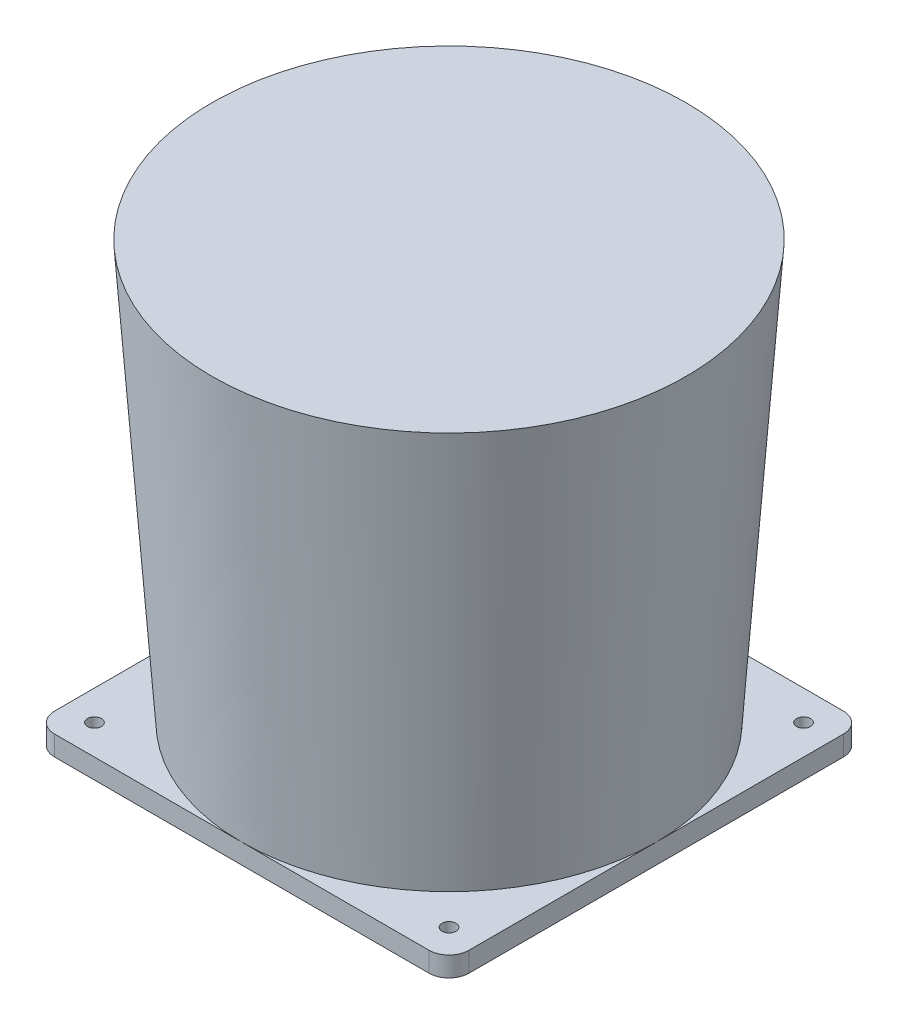
ISO-10303-21;
HEADER;
FILE_DESCRIPTION(('STEP AP214'),'2;1');
FILE_NAME('part.step','',(''),(''),'','','');
FILE_SCHEMA(('AUTOMOTIVE_DESIGN { 1 0 10303 214 1 1 1 1 }'));
ENDSEC;
DATA;
#1=APPLICATION_CONTEXT('core data for automotive mechanical design processes');
#2=APPLICATION_PROTOCOL_DEFINITION('international standard','automotive_design',2000,#1);
#3=PRODUCT_CONTEXT('',#1,'mechanical');
#4=PRODUCT('Part','Part','',(#3));
#5=PRODUCT_RELATED_PRODUCT_CATEGORY('part','',(#4));
#6=PRODUCT_DEFINITION_FORMATION('','',#4);
#7=PRODUCT_DEFINITION_CONTEXT('part definition',#1,'design');
#8=PRODUCT_DEFINITION('design','',#6,#7);
#9=PRODUCT_DEFINITION_SHAPE('','',#8);
#10=(LENGTH_UNIT() NAMED_UNIT(*) SI_UNIT(.MILLI.,.METRE.));
#11=(NAMED_UNIT(*) PLANE_ANGLE_UNIT() SI_UNIT($,.RADIAN.));
#12=(NAMED_UNIT(*) SI_UNIT($,.STERADIAN.) SOLID_ANGLE_UNIT());
#13=UNCERTAINTY_MEASURE_WITH_UNIT(LENGTH_MEASURE(1.E-05),#10,'distance_accuracy_value','');
#14=(GEOMETRIC_REPRESENTATION_CONTEXT(3) GLOBAL_UNCERTAINTY_ASSIGNED_CONTEXT((#13)) GLOBAL_UNIT_ASSIGNED_CONTEXT((#10,
#11,#12)) REPRESENTATION_CONTEXT('',''));
#15=CARTESIAN_POINT('',(0.,0.,0.));
#16=DIRECTION('',(0.,0.,1.));
#17=DIRECTION('',(1.,0.,0.));
#18=AXIS2_PLACEMENT_3D('',#15,#16,#17);
#19=CARTESIAN_POINT('',(94.,10.,-94.));
#20=DIRECTION('',(0.,-1.,0.));
#21=DIRECTION('',(0.,0.,-1.));
#22=AXIS2_PLACEMENT_3D('',#19,#20,#21);
#23=PLANE('',#22);
#24=CARTESIAN_POINT('',(-89.,10.,89.));
#25=DIRECTION('',(0.,1.,0.));
#26=DIRECTION('',(0.,0.,1.));
#27=AXIS2_PLACEMENT_3D('',#24,#25,#26);
#28=CIRCLE('',#27,3.50000000000175);
#29=CARTESIAN_POINT('',(-89.,10.,92.5000000000017));
#30=VERTEX_POINT('',#29);
#31=EDGE_CURVE('E233',#30,#30,#28,.T.);
#32=ORIENTED_EDGE('',*,*,#31,.F.);
#33=EDGE_LOOP('',(#32));
#34=FACE_BOUND('',#33,.T.);
#35=DIRECTION('',(1.,0.,0.));
#36=VECTOR('',#35,1.);
#37=CARTESIAN_POINT('',(-93.9999999999999,10.,104.));
#38=LINE('',#37,#36);
#39=CARTESIAN_POINT('',(-93.9999999999999,10.,104.));
#40=VERTEX_POINT('',#39);
#41=CARTESIAN_POINT('',(0.,10.,104.));
#42=VERTEX_POINT('',#41);
#43=EDGE_CURVE('E139',#40,#42,#38,.T.);
#44=ORIENTED_EDGE('',*,*,#43,.T.);
#45=CARTESIAN_POINT('',(0.,10.,0.));
#46=DIRECTION('',(0.,1.,0.));
#47=DIRECTION('',(0.,0.,1.));
#48=AXIS2_PLACEMENT_3D('',#45,#46,#47);
#49=CIRCLE('',#48,104.);
#50=CARTESIAN_POINT('',(-103.999999999015,10.,-0.000804642853845765));
#51=VERTEX_POINT('',#50);
#52=EDGE_CURVE('E12',#42,#51,#49,.F.);
#53=ORIENTED_EDGE('',*,*,#52,.T.);
#54=DIRECTION('',(0.,0.,1.));
#55=VECTOR('',#54,1.);
#56=CARTESIAN_POINT('',(-104.,10.,-93.9999999999999));
#57=LINE('',#56,#55);
#58=CARTESIAN_POINT('',(-104.,10.,93.9999999999999));
#59=VERTEX_POINT('',#58);
#60=EDGE_CURVE('E291',#51,#59,#57,.T.);
#61=ORIENTED_EDGE('',*,*,#60,.T.);
#62=CARTESIAN_POINT('',(-94.,10.,94.));
#63=DIRECTION('',(0.,1.,0.));
#64=DIRECTION('',(0.,0.,-1.));
#65=AXIS2_PLACEMENT_3D('',#62,#63,#64);
#66=CIRCLE('',#65,9.99999999999999);
#67=EDGE_CURVE('E140',#59,#40,#66,.T.);
#68=ORIENTED_EDGE('',*,*,#67,.T.);
#69=EDGE_LOOP('',(#44,#53,#61,#68));
#70=FACE_BOUND('',#69,.T.);
#71=ADVANCED_FACE('F41',(#34,#70),#23,.F.);
#72=CARTESIAN_POINT('',(-89.,10.,-89.));
#73=DIRECTION('',(0.,1.,0.));
#74=DIRECTION('',(0.,0.,1.));
#75=AXIS2_PLACEMENT_3D('',#72,#73,#74);
#76=CIRCLE('',#75,3.50000000000001);
#77=CARTESIAN_POINT('',(-89.,10.,-85.5));
#78=VERTEX_POINT('',#77);
#79=EDGE_CURVE('E315',#78,#78,#76,.T.);
#80=ORIENTED_EDGE('',*,*,#79,.F.);
#81=EDGE_LOOP('',(#80));
#82=FACE_BOUND('',#81,.T.);
#83=CARTESIAN_POINT('',(-104.,10.,-93.9999999999999));
#84=VERTEX_POINT('',#83);
#85=EDGE_CURVE('E295',#84,#51,#57,.T.);
#86=ORIENTED_EDGE('',*,*,#85,.T.);
#87=CARTESIAN_POINT('',(-104.000000005345,10.,-0.00105930757948736));
#88=CARTESIAN_POINT('',(-104.000090948069,10.,-1.51565821132949));
#89=CARTESIAN_POINT('',(-103.967224943124,10.,-3.03028113036444));
#90=CARTESIAN_POINT('',(-103.835542894028,10.,-6.05310630372781));
#91=CARTESIAN_POINT('',(-103.736881233049,10.,-7.56131529014842));
#92=CARTESIAN_POINT('',(-103.473630479143,10.,-10.5713033642664));
#93=CARTESIAN_POINT('',(-103.309069903499,10.,-12.073084949627));
#94=CARTESIAN_POINT('',(-102.91416092981,10.,-15.070284790968));
#95=CARTESIAN_POINT('',(-102.683715380538,10.,-16.5656903155941));
#96=CARTESIAN_POINT('',(-102.289257574568,10.,-18.8014926673374));
#97=CARTESIAN_POINT('',(-102.149484797689,10.,-19.5462429453046));
#98=CARTESIAN_POINT('',(-101.853743818732,10.,-21.0330955937771));
#99=CARTESIAN_POINT('',(-101.697763673546,10.,-21.775195588785));
#100=CARTESIAN_POINT('',(-101.206492888748,10.,-23.9921354203146));
#101=CARTESIAN_POINT('',(-100.847147605813,10.,-25.4617224986629));
#102=CARTESIAN_POINT('',(-100.065015205125,10.,-28.3816803686328));
#103=CARTESIAN_POINT('',(-99.6423168158635,10.,-29.8320749962868));
#104=CARTESIAN_POINT('',(-98.7335883078366,10.,-32.7137382665067));
#105=CARTESIAN_POINT('',(-98.247525039415,10.,-34.1449964625821));
#106=CARTESIAN_POINT('',(-97.2123192263897,10.,-36.9880772090676));
#107=CARTESIAN_POINT('',(-96.6630399574596,10.,-38.3998499460064));
#108=CARTESIAN_POINT('',(-95.5037294098261,10.,-41.1987226060328));
#109=CARTESIAN_POINT('',(-94.8936800045291,10.,-42.5858150211537));
#110=CARTESIAN_POINT('',(-93.61514007437,10.,-45.3284781834845));
#111=CARTESIAN_POINT('',(-92.9468036444064,10.,-46.684120729026));
#112=CARTESIAN_POINT('',(-91.5517058994502,10.,-49.3642420897551));
#113=CARTESIAN_POINT('',(-90.8249699653429,10.,-50.6887341231206));
#114=CARTESIAN_POINT('',(-89.3131467979113,10.,-53.3066616782509));
#115=CARTESIAN_POINT('',(-88.5279746714181,10.,-54.6000482573516));
#116=CARTESIAN_POINT('',(-87.3079361414785,10.,-56.5147113661087));
#117=CARTESIAN_POINT('',(-86.8937971972617,10.,-57.149285744373));
#118=CARTESIAN_POINT('',(-86.0515734707941,10.,-58.4097847203422));
#119=CARTESIAN_POINT('',(-85.6234786846684,10.,-59.035702633872));
#120=CARTESIAN_POINT('',(-84.3212180203946,10.,-60.8958866041932));
#121=CARTESIAN_POINT('',(-83.426838688626,10.,-62.1160944176063));
#122=CARTESIAN_POINT('',(-81.5868219835373,10.,-64.5144769246347));
#123=CARTESIAN_POINT('',(-80.641257521089,10.,-65.6927076393856));
#124=CARTESIAN_POINT('',(-78.6989378208423,10.,-68.0072615757161));
#125=CARTESIAN_POINT('',(-77.7021560100378,10.,-69.1435625068051));
#126=CARTESIAN_POINT('',(-75.6577503067496,10.,-71.3740703014073));
#127=CARTESIAN_POINT('',(-74.6100190765356,10.,-72.4681787443568));
#128=CARTESIAN_POINT('',(-72.4678708336528,10.,-74.6103523228499));
#129=CARTESIAN_POINT('',(-71.3734399395446,10.,-75.6584035773488));
#130=CARTESIAN_POINT('',(-69.1426481751464,10.,-77.7030204834573));
#131=CARTESIAN_POINT('',(-68.0064021661485,10.,-78.6997114073254));
#132=CARTESIAN_POINT('',(-65.6918608487904,10.,-80.6419412321208));
#133=CARTESIAN_POINT('',(-64.5135840242304,10.,-81.5875021691134));
#134=CARTESIAN_POINT('',(-62.1150081109515,10.,-83.4275993266169));
#135=CARTESIAN_POINT('',(-60.8946494087953,10.,-84.3220579574577));
#136=CARTESIAN_POINT('',(-59.0347733235027,10.,-85.6240852583414));
#137=CARTESIAN_POINT('',(-58.4093168266245,10.,-86.0518717102847));
#138=CARTESIAN_POINT('',(-57.1488325311045,10.,-86.8941144214826));
#139=CARTESIAN_POINT('',(-56.5137980896977,10.,-87.3085607394228));
#140=CARTESIAN_POINT('',(-54.5988046585761,10.,-88.5287923257081));
#141=CARTESIAN_POINT('',(-53.3055507936302,10.,-89.313854207235));
#142=CARTESIAN_POINT('',(-50.6877736601868,10.,-90.825528097638));
#143=CARTESIAN_POINT('',(-49.3632963500548,10.,-91.5522198272704));
#144=CARTESIAN_POINT('',(-46.6830864326956,10.,-92.9472952703507));
#145=CARTESIAN_POINT('',(-45.3273378391152,10.,-93.6156482857507));
#146=CARTESIAN_POINT('',(-42.5849750647467,10.,-94.8940090808997));
#147=CARTESIAN_POINT('',(-41.1982993338393,10.,-95.5038847549417));
#148=CARTESIAN_POINT('',(-38.3994407994003,10.,-96.663229411321));
#149=CARTESIAN_POINT('',(-36.9872505738178,10.,-97.2126804759602));
#150=CARTESIAN_POINT('',(-34.1438307518791,10.,-98.2479720271496));
#151=CARTESIAN_POINT('',(-32.7126592710593,10.,-98.7339720331168));
#152=CARTESIAN_POINT('',(-29.8310428596772,10.,-99.642622157048));
#153=CARTESIAN_POINT('',(-28.3806065731884,10.,-100.065299707462));
#154=CARTESIAN_POINT('',(-25.4604367686001,10.,-100.847432893674));
#155=CARTESIAN_POINT('',(-23.9906778671737,10.,-101.206794033229));
#156=CARTESIAN_POINT('',(-21.7741081737267,10.,-101.697967819071));
#157=CARTESIAN_POINT('',(-21.0325508691531,10.,-101.853840036719));
#158=CARTESIAN_POINT('',(-19.5457027808298,10.,-102.149604377217));
#159=CARTESIAN_POINT('',(-18.8004096996578,10.,-102.289484951621));
#160=CARTESIAN_POINT('',(-16.5642288470623,10.,-102.683995250954));
#161=CARTESIAN_POINT('',(-15.0689897626204,10.,-102.914391294585));
#162=CARTESIAN_POINT('',(-12.0719820030276,10.,-103.309216079795));
#163=CARTESIAN_POINT('',(-10.5702252915449,10.,-103.47373606213));
#164=CARTESIAN_POINT('',(-7.56017924553489,10.,-103.736946937213));
#165=CARTESIAN_POINT('',(-6.05188690489492,10.,-103.835603352027));
#166=CARTESIAN_POINT('',(-3.0289977809494,10.,-103.967195505187));
#167=CARTESIAN_POINT('',(-1.51439443188354,10.,-103.999985444928));
#168=CARTESIAN_POINT('',(0.000336290081343829,10.,-104.000000003232));
#169=CARTESIAN_POINT('',(0.000672580152371716,10.,-104.000000004848));
#170=CARTESIAN_POINT('',(0.00100887021307894,10.,-104.000000004848));
#171=B_SPLINE_CURVE_WITH_KNOTS('',3,(#87,#88,#89,#90,#91,#92,#93,#94,#95,#96,#97,#98,#99,#100,
#101,#102,#103,#104,#105,#106,#107,#108,#109,#110,#111,#112,#113,#114,#115,#116,#117,#118,#119,
#120,#121,#122,#123,#124,#125,#126,#127,#128,#129,#130,#131,#132,#133,#134,#135,#136,#137,#138,
#139,#140,#141,#142,#143,#144,#145,#146,#147,#148,#149,#150,#151,#152,#153,#154,#155,#156,#157,
#158,#159,#160,#161,#162,#163,#164,#165,#166,#167,#168,#169,#170),.UNSPECIFIED.,.F.,.F.,(4,2,2,
2,2,2,2,2,2,2,2,2,2,2,2,2,2,2,2,2,2,2,2,2,2,2,2,2,2,2,2,2,2,2,2,2,2,2,2,2,2,4),(0.,
4.54347549026458,9.07632748747786,13.6072200414745,18.1448284261085,20.4179338465936,
22.6927263457125,27.2298097385969,31.7605971432414,36.293764436362,40.8369271977771,
45.3814491805512,49.9143011956988,54.4451937429382,58.9828020961645,61.2559201041982,
63.530705004386,68.0677946515812,72.5985833021657,77.1317468684416,81.6749136069253,
86.2194403362525,90.7522998028763,95.2831898613313,99.8207857997902,102.093906517359,
104.368683730776,108.90577956242,113.436569455668,117.969729272979,122.512899862368,
127.057414025246,131.590273509253,136.121163561172,140.658759469218,142.931892775059,
145.206657402598,149.743753264119,154.274543162907,158.807702961388,163.350886117829,
163.351894988042),.UNSPECIFIED.);
#172=CARTESIAN_POINT('',(0.000754439560846682,10.,-103.999999999077));
#173=VERTEX_POINT('',#172);
#174=EDGE_CURVE('E51',#51,#173,#171,.T.);
#175=ORIENTED_EDGE('',*,*,#174,.T.);
#176=DIRECTION('',(-1.,0.,0.));
#177=VECTOR('',#176,1.);
#178=CARTESIAN_POINT('',(-93.9999999999999,10.,-104.));
#179=LINE('',#178,#177);
#180=CARTESIAN_POINT('',(-93.9999999999999,10.,-104.));
#181=VERTEX_POINT('',#180);
#182=EDGE_CURVE('E278',#173,#181,#179,.T.);
#183=ORIENTED_EDGE('',*,*,#182,.T.);
#184=CARTESIAN_POINT('',(-94.,10.,-94.));
#185=DIRECTION('',(0.,1.,0.));
#186=DIRECTION('',(0.,0.,-1.));
#187=AXIS2_PLACEMENT_3D('',#184,#185,#186);
#188=CIRCLE('',#187,9.99999999999999);
#189=EDGE_CURVE('E287',#181,#84,#188,.T.);
#190=ORIENTED_EDGE('',*,*,#189,.T.);
#191=EDGE_LOOP('',(#86,#175,#183,#190));
#192=FACE_BOUND('',#191,.T.);
#193=ADVANCED_FACE('F224',(#82,#192),#23,.F.);
#194=CARTESIAN_POINT('',(89.,10.,-89.));
#195=DIRECTION('',(0.,1.,0.));
#196=DIRECTION('',(0.,0.,1.));
#197=AXIS2_PLACEMENT_3D('',#194,#195,#196);
#198=CIRCLE('',#197,3.50000000000001);
#199=CARTESIAN_POINT('',(89.,10.,-85.5));
#200=VERTEX_POINT('',#199);
#201=EDGE_CURVE('E325',#200,#200,#198,.T.);
#202=ORIENTED_EDGE('',*,*,#201,.F.);
#203=EDGE_LOOP('',(#202));
#204=FACE_BOUND('',#203,.T.);
#205=CARTESIAN_POINT('',(93.9999999999999,10.,-104.));
#206=VERTEX_POINT('',#205);
#207=EDGE_CURVE('E108',#206,#173,#179,.T.);
#208=ORIENTED_EDGE('',*,*,#207,.T.);
#209=CARTESIAN_POINT('',(0.00100887021307894,10.,-104.000000004848));
#210=CARTESIAN_POINT('',(1.51561451680244,10.,-104.000090941459));
#211=CARTESIAN_POINT('',(3.03024420049366,10.,-103.967225133267));
#212=CARTESIAN_POINT('',(6.05307959472923,10.,-103.835543575761));
#213=CARTESIAN_POINT('',(7.56129204361695,10.,-103.736882353868));
#214=CARTESIAN_POINT('',(10.5712837377115,10.,-103.473632564446));
#215=CARTESIAN_POINT('',(12.0730654933182,10.,-103.309072659799));
#216=CARTESIAN_POINT('',(15.0702623715824,10.,-102.914165170491));
#217=CARTESIAN_POINT('',(16.5656647817985,10.,-102.683720578572));
#218=CARTESIAN_POINT('',(18.8014735868845,10.,-102.28926174863));
#219=CARTESIAN_POINT('',(19.5462334282141,10.,-102.14948698789));
#220=CARTESIAN_POINT('',(21.0330868818602,10.,-101.85374525414));
#221=CARTESIAN_POINT('',(21.7751781971805,10.,-101.697766732735));
#222=CARTESIAN_POINT('',(23.9921143884801,10.,-101.206496810006));
#223=CARTESIAN_POINT('',(25.4617064966351,10.,-100.847150704301));
#224=CARTESIAN_POINT('',(28.3816711904251,10.,-100.0650173354));
#225=CARTESIAN_POINT('',(29.8320676497809,10.,-99.6423189411209));
#226=CARTESIAN_POINT('',(32.7137313848828,10.,-98.7335912402981));
#227=CARTESIAN_POINT('',(34.1449882579219,10.,-98.2475289229873));
#228=CARTESIAN_POINT('',(36.9880709342946,10.,-97.212322634871));
#229=CARTESIAN_POINT('',(38.3998468472228,10.,-96.6630417285194));
#230=CARTESIAN_POINT('',(41.1987208852788,10.,-95.5037296349047));
#231=CARTESIAN_POINT('',(42.585811588862,10.,-94.8936805297297));
#232=CARTESIAN_POINT('',(45.3284763530026,10.,-93.61513990992));
#233=CARTESIAN_POINT('',(46.6841221170296,10.,-92.9468022866211));
#234=CARTESIAN_POINT('',(49.3642468648275,10.,-91.5517034384903));
#235=CARTESIAN_POINT('',(50.68873913394,10.,-90.8249677235274));
#236=CARTESIAN_POINT('',(53.3066641682316,10.,-89.3131464010964));
#237=CARTESIAN_POINT('',(54.6000480629516,10.,-88.5279760256605));
#238=CARTESIAN_POINT('',(56.514709394443,10.,-87.3079381299116));
#239=CARTESIAN_POINT('',(57.1492847742005,10.,-86.8937982108483));
#240=CARTESIAN_POINT('',(58.4097828084504,10.,-86.0515743826413));
#241=CARTESIAN_POINT('',(59.0356988204453,10.,-85.6234805320113));
#242=CARTESIAN_POINT('',(60.895883192601,10.,-84.3212188827711));
#243=CARTESIAN_POINT('',(62.1160933507799,10.,-83.4268376994823));
#244=CARTESIAN_POINT('',(64.5144792567646,10.,-81.586818310182));
#245=CARTESIAN_POINT('',(65.6927110694804,10.,-80.641253072022));
#246=CARTESIAN_POINT('',(68.0072659452276,10.,-78.6989328914039));
#247=CARTESIAN_POINT('',(69.14356676451,10.,-77.7021514316552));
#248=CARTESIAN_POINT('',(71.3740730315867,10.,-75.6577474519084));
#249=CARTESIAN_POINT('',(72.4681801076416,10.,-74.6100176474024));
#250=CARTESIAN_POINT('',(74.6103530138693,10.,-72.4678702085261));
#251=CARTESIAN_POINT('',(75.6584048740175,10.,-71.373438603734));
#252=CARTESIAN_POINT('',(77.7030229586479,10.,-69.1426453960127));
#253=CARTESIAN_POINT('',(78.6997144554631,10.,-68.0063986544308));
#254=CARTESIAN_POINT('',(80.6419453566337,10.,-65.6918558133157));
#255=CARTESIAN_POINT('',(81.5875067969828,10.,-64.5135781975213));
#256=CARTESIAN_POINT('',(83.4276048944116,10.,-62.1150006477165));
#257=CARTESIAN_POINT('',(84.3220639614857,10.,-60.8946411000219));
#258=CARTESIAN_POINT('',(85.6240894731215,10.,-59.0347671689339));
#259=CARTESIAN_POINT('',(86.0518737923416,10.,-58.4093137326245));
#260=CARTESIAN_POINT('',(86.8941160774259,10.,-57.1488300308687));
#261=CARTESIAN_POINT('',(87.308563980822,10.,-56.513793041702));
#262=CARTESIAN_POINT('',(88.528796231061,10.,-54.5987978476888));
#263=CARTESIAN_POINT('',(89.3138572052576,10.,-53.3055447835145));
#264=CARTESIAN_POINT('',(90.8255302149719,10.,-50.6877678815788));
#265=CARTESIAN_POINT('',(91.5522219079033,10.,-49.3632899656406));
#266=CARTESIAN_POINT('',(92.947298138402,10.,-46.6830774289987));
#267=CARTESIAN_POINT('',(93.6156519133494,10.,-45.327326788325));
#268=CARTESIAN_POINT('',(94.8940117874935,10.,-42.5849662405147));
#269=CARTESIAN_POINT('',(95.5038860500137,10.,-41.1982949086025));
#270=CARTESIAN_POINT('',(96.6632312241082,10.,-38.3994377221183));
#271=CARTESIAN_POINT('',(97.2126838930852,10.,-36.987244310899));
#272=CARTESIAN_POINT('',(98.2479758952411,10.,-34.1438225506461));
#273=CARTESIAN_POINT('',(98.7339749591242,10.,-32.7126523940947));
#274=CARTESIAN_POINT('',(99.6426242833872,10.,-29.8310355157729));
#275=CARTESIAN_POINT('',(100.065301837325,10.,-28.380597394298));
#276=CARTESIAN_POINT('',(100.847435991797,10.,-25.4604207604529));
#277=CARTESIAN_POINT('',(101.206797955687,10.,-23.9906568270793));
#278=CARTESIAN_POINT('',(101.697970880219,10.,-21.7740907751389));
#279=CARTESIAN_POINT('',(101.853841473224,10.,-21.0325421537485));
#280=CARTESIAN_POINT('',(102.149606566674,10.,-19.5456932691382));
#281=CARTESIAN_POINT('',(102.289489123985,10.,-18.8003906299701));
#282=CARTESIAN_POINT('',(102.68400044602,10.,-16.564203326291));
#283=CARTESIAN_POINT('',(102.914395532299,10.,-15.0689673530052));
#284=CARTESIAN_POINT('',(103.309218833818,10.,-12.0719625516511));
#285=CARTESIAN_POINT('',(103.473738145796,10.,-10.5702056683216));
#286=CARTESIAN_POINT('',(103.736948056036,10.,-7.5601559935091));
#287=CARTESIAN_POINT('',(103.835604030824,10.,-6.05186018323964));
#288=CARTESIAN_POINT('',(103.967194965748,10.,-3.02897764513368));
#289=CARTESIAN_POINT('',(103.999984717412,10.,-1.51438437819361));
#290=CARTESIAN_POINT('',(104.000000003563,10.,0.000353101567140524));
#291=CARTESIAN_POINT('',(104.000000005345,10.,0.00070620312292461));
#292=CARTESIAN_POINT('',(104.000000005345,10.,0.00105930466733073));
#293=B_SPLINE_CURVE_WITH_KNOTS('',3,(#209,#210,#211,#212,#213,#214,#215,#216,#217,#218,#219,
#220,#221,#222,#223,#224,#225,#226,#227,#228,#229,#230,#231,#232,#233,#234,#235,#236,#237,#238,
#239,#240,#241,#242,#243,#244,#245,#246,#247,#248,#249,#250,#251,#252,#253,#254,#255,#256,#257,
#258,#259,#260,#261,#262,#263,#264,#265,#266,#267,#268,#269,#270,#271,#272,#273,#274,#275,#276,
#277,#278,#279,#280,#281,#282,#283,#284,#285,#286,#287,#288,#289,#290,#291,#292),.UNSPECIFIED.,
.F.,.F.,(4,2,2,2,2,2,2,2,2,2,2,2,2,2,2,2,2,2,2,2,2,2,2,2,2,2,2,2,2,2,2,2,2,2,2,2,2,2,2,2,2,4),
(0.,4.54349575704833,9.07635804322917,13.6072508814732,18.1448495760281,20.4179842808059,
22.6927503065208,27.2298489547168,31.7606416403057,36.2938042417496,40.8369776238197,
45.3814945788148,49.9143568476552,54.4452496924215,58.9828484173232,61.2559705345055,
63.5307491457461,68.0678477645359,72.5986404446794,77.1318030646696,81.6749638797527,
86.219493400564,90.7523556520595,95.28324850335,99.8208472586088,102.093956788204,
104.368742997946,108.905835362718,113.436626796964,117.969793143584,122.512949981877,
127.057474753964,131.590329553371,136.121224893669,140.65883606475,142.931942886314,
145.206736781852,149.743822961953,154.274613153519,158.807783249295,163.350936237725,
163.351995542392),.UNSPECIFIED.);
#294=CARTESIAN_POINT('',(103.999999999015,10.,0.000804641397700825));
#295=VERTEX_POINT('',#294);
#296=EDGE_CURVE('E277',#173,#295,#293,.T.);
#297=ORIENTED_EDGE('',*,*,#296,.T.);
#298=DIRECTION('',(0.,0.,-1.));
#299=VECTOR('',#298,1.);
#300=CARTESIAN_POINT('',(104.,10.,-94.));
#301=LINE('',#300,#299);
#302=CARTESIAN_POINT('',(104.,10.,-94.));
#303=VERTEX_POINT('',#302);
#304=EDGE_CURVE('E65',#295,#303,#301,.T.);
#305=ORIENTED_EDGE('',*,*,#304,.T.);
#306=CARTESIAN_POINT('',(94.,10.,-94.));
#307=DIRECTION('',(0.,1.,0.));
#308=DIRECTION('',(0.,0.,-1.));
#309=AXIS2_PLACEMENT_3D('',#306,#307,#308);
#310=CIRCLE('',#309,9.99999999999999);
#311=EDGE_CURVE('E258',#303,#206,#310,.T.);
#312=ORIENTED_EDGE('',*,*,#311,.T.);
#313=EDGE_LOOP('',(#208,#297,#305,#312));
#314=FACE_BOUND('',#313,.T.);
#315=ADVANCED_FACE('F193',(#204,#314),#23,.F.);
#316=CARTESIAN_POINT('',(104.,10.,93.9999999999999));
#317=VERTEX_POINT('',#316);
#318=EDGE_CURVE('E160',#317,#295,#301,.T.);
#319=ORIENTED_EDGE('',*,*,#318,.T.);
#320=CARTESIAN_POINT('',(0.,10.,0.));
#321=DIRECTION('',(0.,1.,0.));
#322=DIRECTION('',(0.,0.,1.));
#323=AXIS2_PLACEMENT_3D('',#320,#321,#322);
#324=CIRCLE('',#323,104.);
#325=EDGE_CURVE('E133',#42,#295,#324,.T.);
#326=ORIENTED_EDGE('',*,*,#325,.F.);
#327=CARTESIAN_POINT('',(93.9999999999999,10.,104.));
#328=VERTEX_POINT('',#327);
#329=EDGE_CURVE('E125',#42,#328,#38,.T.);
#330=ORIENTED_EDGE('',*,*,#329,.T.);
#331=CARTESIAN_POINT('',(94.,10.,94.));
#332=DIRECTION('',(0.,1.,0.));
#333=DIRECTION('',(0.,0.,-1.));
#334=AXIS2_PLACEMENT_3D('',#331,#332,#333);
#335=CIRCLE('',#334,9.99999999999999);
#336=EDGE_CURVE('E131',#328,#317,#335,.T.);
#337=ORIENTED_EDGE('',*,*,#336,.T.);
#338=EDGE_LOOP('',(#319,#326,#330,#337));
#339=FACE_BOUND('',#338,.T.);
#340=CARTESIAN_POINT('',(89.,10.,89.));
#341=DIRECTION('',(0.,1.,0.));
#342=DIRECTION('',(0.,0.,1.));
#343=AXIS2_PLACEMENT_3D('',#340,#341,#342);
#344=CIRCLE('',#343,3.50000000000176);
#345=CARTESIAN_POINT('',(89.,10.,92.5000000000017));
#346=VERTEX_POINT('',#345);
#347=EDGE_CURVE('E331',#346,#346,#344,.T.);
#348=ORIENTED_EDGE('',*,*,#347,.F.);
#349=EDGE_LOOP('',(#348));
#350=FACE_BOUND('',#349,.T.);
#351=ADVANCED_FACE('F128',(#339,#350),#23,.F.);
#352=CARTESIAN_POINT('',(94.,0.,-94.));
#353=DIRECTION('',(0.,-1.,0.));
#354=DIRECTION('',(0.,0.,-1.));
#355=AXIS2_PLACEMENT_3D('',#352,#353,#354);
#356=PLANE('',#355);
#357=CARTESIAN_POINT('',(89.,0.,89.));
#358=DIRECTION('',(0.,1.,0.));
#359=DIRECTION('',(0.,0.,1.));
#360=AXIS2_PLACEMENT_3D('',#357,#358,#359);
#361=CIRCLE('',#360,3.50000000000176);
#362=CARTESIAN_POINT('',(89.,0.,92.5000000000017));
#363=VERTEX_POINT('',#362);
#364=EDGE_CURVE('E335',#363,#363,#361,.T.);
#365=ORIENTED_EDGE('',*,*,#364,.T.);
#366=EDGE_LOOP('',(#365));
#367=FACE_BOUND('',#366,.T.);
#368=CARTESIAN_POINT('',(-89.,0.,-89.));
#369=DIRECTION('',(0.,1.,0.));
#370=DIRECTION('',(0.,0.,1.));
#371=AXIS2_PLACEMENT_3D('',#368,#369,#370);
#372=CIRCLE('',#371,3.50000000000001);
#373=CARTESIAN_POINT('',(-89.,0.,-85.5));
#374=VERTEX_POINT('',#373);
#375=EDGE_CURVE('E319',#374,#374,#372,.T.);
#376=ORIENTED_EDGE('',*,*,#375,.T.);
#377=EDGE_LOOP('',(#376));
#378=FACE_BOUND('',#377,.T.);
#379=CARTESIAN_POINT('',(94.,0.,-94.));
#380=DIRECTION('',(0.,1.,0.));
#381=DIRECTION('',(0.,0.,-1.));
#382=AXIS2_PLACEMENT_3D('',#379,#380,#381);
#383=CIRCLE('',#382,9.99999999999999);
#384=CARTESIAN_POINT('',(104.,0.,-94.));
#385=VERTEX_POINT('',#384);
#386=CARTESIAN_POINT('',(93.9999999999999,0.,-104.));
#387=VERTEX_POINT('',#386);
#388=EDGE_CURVE('E169',#385,#387,#383,.T.);
#389=ORIENTED_EDGE('',*,*,#388,.F.);
#390=DIRECTION('',(0.,0.,-1.));
#391=VECTOR('',#390,1.);
#392=CARTESIAN_POINT('',(104.,0.,-94.));
#393=LINE('',#392,#391);
#394=CARTESIAN_POINT('',(104.,0.,93.9999999999999));
#395=VERTEX_POINT('',#394);
#396=EDGE_CURVE('E99',#395,#385,#393,.T.);
#397=ORIENTED_EDGE('',*,*,#396,.F.);
#398=CARTESIAN_POINT('',(94.,0.,94.));
#399=DIRECTION('',(0.,1.,0.));
#400=DIRECTION('',(0.,0.,-1.));
#401=AXIS2_PLACEMENT_3D('',#398,#399,#400);
#402=CIRCLE('',#401,9.99999999999999);
#403=CARTESIAN_POINT('',(93.9999999999999,0.,104.));
#404=VERTEX_POINT('',#403);
#405=EDGE_CURVE('E246',#404,#395,#402,.T.);
#406=ORIENTED_EDGE('',*,*,#405,.F.);
#407=DIRECTION('',(1.,0.,0.));
#408=VECTOR('',#407,1.);
#409=CARTESIAN_POINT('',(-93.9999999999999,0.,104.));
#410=LINE('',#409,#408);
#411=CARTESIAN_POINT('',(-93.9999999999999,0.,104.));
#412=VERTEX_POINT('',#411);
#413=EDGE_CURVE('E147',#412,#404,#410,.T.);
#414=ORIENTED_EDGE('',*,*,#413,.F.);
#415=CARTESIAN_POINT('',(-94.,0.,94.));
#416=DIRECTION('',(0.,1.,0.));
#417=DIRECTION('',(0.,0.,-1.));
#418=AXIS2_PLACEMENT_3D('',#415,#416,#417);
#419=CIRCLE('',#418,9.99999999999999);
#420=CARTESIAN_POINT('',(-104.,0.,93.9999999999999));
#421=VERTEX_POINT('',#420);
#422=EDGE_CURVE('E245',#421,#412,#419,.T.);
#423=ORIENTED_EDGE('',*,*,#422,.F.);
#424=DIRECTION('',(0.,0.,1.));
#425=VECTOR('',#424,1.);
#426=CARTESIAN_POINT('',(-104.,0.,-93.9999999999999));
#427=LINE('',#426,#425);
#428=CARTESIAN_POINT('',(-104.,0.,-93.9999999999999));
#429=VERTEX_POINT('',#428);
#430=EDGE_CURVE('E252',#429,#421,#427,.T.);
#431=ORIENTED_EDGE('',*,*,#430,.F.);
#432=CARTESIAN_POINT('',(-94.,0.,-94.));
#433=DIRECTION('',(0.,1.,0.));
#434=DIRECTION('',(0.,0.,-1.));
#435=AXIS2_PLACEMENT_3D('',#432,#433,#434);
#436=CIRCLE('',#435,9.99999999999999);
#437=CARTESIAN_POINT('',(-93.9999999999999,0.,-104.));
#438=VERTEX_POINT('',#437);
#439=EDGE_CURVE('E307',#438,#429,#436,.T.);
#440=ORIENTED_EDGE('',*,*,#439,.F.);
#441=DIRECTION('',(-1.,0.,0.));
#442=VECTOR('',#441,1.);
#443=CARTESIAN_POINT('',(-93.9999999999999,0.,-104.));
#444=LINE('',#443,#442);
#445=EDGE_CURVE('E309',#387,#438,#444,.T.);
#446=ORIENTED_EDGE('',*,*,#445,.F.);
#447=EDGE_LOOP('',(#389,#397,#406,#414,#423,#431,#440,#446));
#448=FACE_BOUND('',#447,.T.);
#449=CARTESIAN_POINT('',(89.,0.,-89.));
#450=DIRECTION('',(0.,1.,0.));
#451=DIRECTION('',(0.,0.,1.));
#452=AXIS2_PLACEMENT_3D('',#449,#450,#451);
#453=CIRCLE('',#452,3.50000000000001);
#454=CARTESIAN_POINT('',(89.,0.,-85.5));
#455=VERTEX_POINT('',#454);
#456=EDGE_CURVE('E327',#455,#455,#453,.T.);
#457=ORIENTED_EDGE('',*,*,#456,.T.);
#458=EDGE_LOOP('',(#457));
#459=FACE_BOUND('',#458,.T.);
#460=CARTESIAN_POINT('',(-89.,0.,89.));
#461=DIRECTION('',(0.,1.,0.));
#462=DIRECTION('',(0.,0.,1.));
#463=AXIS2_PLACEMENT_3D('',#460,#461,#462);
#464=CIRCLE('',#463,3.50000000000175);
#465=CARTESIAN_POINT('',(-89.,0.,92.5000000000017));
#466=VERTEX_POINT('',#465);
#467=EDGE_CURVE('E342',#466,#466,#464,.T.);
#468=ORIENTED_EDGE('',*,*,#467,.T.);
#469=EDGE_LOOP('',(#468));
#470=FACE_BOUND('',#469,.T.);
#471=ADVANCED_FACE('F192',(#367,#378,#448,#459,#470),#356,.T.);
#472=CARTESIAN_POINT('',(94.,10.,-94.));
#473=DIRECTION('',(0.,-1.,0.));
#474=DIRECTION('',(0.,0.,-1.));
#475=AXIS2_PLACEMENT_3D('',#472,#473,#474);
#476=CYLINDRICAL_SURFACE('',#475,9.99999999999999);
#477=ORIENTED_EDGE('',*,*,#388,.T.);
#478=DIRECTION('',(0.,-1.,0.));
#479=VECTOR('',#478,1.);
#480=CARTESIAN_POINT('',(93.9999999999999,10.,-104.));
#481=LINE('',#480,#479);
#482=EDGE_CURVE('E274',#206,#387,#481,.T.);
#483=ORIENTED_EDGE('',*,*,#482,.F.);
#484=ORIENTED_EDGE('',*,*,#311,.F.);
#485=DIRECTION('',(0.,-1.,0.));
#486=VECTOR('',#485,1.);
#487=CARTESIAN_POINT('',(104.,10.,-94.));
#488=LINE('',#487,#486);
#489=EDGE_CURVE('E174',#303,#385,#488,.T.);
#490=ORIENTED_EDGE('',*,*,#489,.T.);
#491=EDGE_LOOP('',(#477,#483,#484,#490));
#492=FACE_BOUND('',#491,.T.);
#493=ADVANCED_FACE('F43',(#492),#476,.T.);
#494=CARTESIAN_POINT('',(-93.9999999999999,10.,-104.));
#495=DIRECTION('',(0.,0.,1.));
#496=DIRECTION('',(1.,0.,0.));
#497=AXIS2_PLACEMENT_3D('',#494,#495,#496);
#498=PLANE('',#497);
#499=ORIENTED_EDGE('',*,*,#445,.T.);
#500=DIRECTION('',(0.,-1.,0.));
#501=VECTOR('',#500,1.);
#502=CARTESIAN_POINT('',(-93.9999999999999,10.,-104.));
#503=LINE('',#502,#501);
#504=EDGE_CURVE('E270',#181,#438,#503,.T.);
#505=ORIENTED_EDGE('',*,*,#504,.F.);
#506=ORIENTED_EDGE('',*,*,#182,.F.);
#507=ORIENTED_EDGE('',*,*,#207,.F.);
#508=ORIENTED_EDGE('',*,*,#482,.T.);
#509=EDGE_LOOP('',(#499,#505,#506,#507,#508));
#510=FACE_BOUND('',#509,.T.);
#511=ADVANCED_FACE('F216',(#510),#498,.F.);
#512=CARTESIAN_POINT('',(-94.,10.,-94.));
#513=DIRECTION('',(0.,-1.,0.));
#514=DIRECTION('',(0.,0.,-1.));
#515=AXIS2_PLACEMENT_3D('',#512,#513,#514);
#516=CYLINDRICAL_SURFACE('',#515,9.99999999999999);
#517=ORIENTED_EDGE('',*,*,#439,.T.);
#518=DIRECTION('',(0.,-1.,0.));
#519=VECTOR('',#518,1.);
#520=CARTESIAN_POINT('',(-104.,10.,-93.9999999999999));
#521=LINE('',#520,#519);
#522=EDGE_CURVE('E266',#84,#429,#521,.T.);
#523=ORIENTED_EDGE('',*,*,#522,.F.);
#524=ORIENTED_EDGE('',*,*,#189,.F.);
#525=ORIENTED_EDGE('',*,*,#504,.T.);
#526=EDGE_LOOP('',(#517,#523,#524,#525));
#527=FACE_BOUND('',#526,.T.);
#528=ADVANCED_FACE('F213',(#527),#516,.T.);
#529=CARTESIAN_POINT('',(-104.,10.,-93.9999999999999));
#530=DIRECTION('',(1.,0.,0.));
#531=DIRECTION('',(0.,0.,-1.));
#532=AXIS2_PLACEMENT_3D('',#529,#530,#531);
#533=PLANE('',#532);
#534=ORIENTED_EDGE('',*,*,#430,.T.);
#535=DIRECTION('',(0.,-1.,0.));
#536=VECTOR('',#535,1.);
#537=CARTESIAN_POINT('',(-104.,10.,93.9999999999999));
#538=LINE('',#537,#536);
#539=EDGE_CURVE('E238',#59,#421,#538,.T.);
#540=ORIENTED_EDGE('',*,*,#539,.F.);
#541=ORIENTED_EDGE('',*,*,#60,.F.);
#542=ORIENTED_EDGE('',*,*,#85,.F.);
#543=ORIENTED_EDGE('',*,*,#522,.T.);
#544=EDGE_LOOP('',(#534,#540,#541,#542,#543));
#545=FACE_BOUND('',#544,.T.);
#546=ADVANCED_FACE('F209',(#545),#533,.F.);
#547=CARTESIAN_POINT('',(-94.,10.,94.));
#548=DIRECTION('',(0.,-1.,0.));
#549=DIRECTION('',(0.,0.,-1.));
#550=AXIS2_PLACEMENT_3D('',#547,#548,#549);
#551=CYLINDRICAL_SURFACE('',#550,9.99999999999999);
#552=ORIENTED_EDGE('',*,*,#422,.T.);
#553=DIRECTION('',(0.,-1.,0.));
#554=VECTOR('',#553,1.);
#555=CARTESIAN_POINT('',(-93.9999999999999,10.,104.));
#556=LINE('',#555,#554);
#557=EDGE_CURVE('E151',#40,#412,#556,.T.);
#558=ORIENTED_EDGE('',*,*,#557,.F.);
#559=ORIENTED_EDGE('',*,*,#67,.F.);
#560=ORIENTED_EDGE('',*,*,#539,.T.);
#561=EDGE_LOOP('',(#552,#558,#559,#560));
#562=FACE_BOUND('',#561,.T.);
#563=ADVANCED_FACE('F206',(#562),#551,.T.);
#564=CARTESIAN_POINT('',(-93.9999999999999,10.,104.));
#565=DIRECTION('',(0.,0.,-1.));
#566=DIRECTION('',(-1.,0.,0.));
#567=AXIS2_PLACEMENT_3D('',#564,#565,#566);
#568=PLANE('',#567);
#569=ORIENTED_EDGE('',*,*,#413,.T.);
#570=DIRECTION('',(0.,-1.,0.));
#571=VECTOR('',#570,1.);
#572=CARTESIAN_POINT('',(93.9999999999999,10.,104.));
#573=LINE('',#572,#571);
#574=EDGE_CURVE('E143',#328,#404,#573,.T.);
#575=ORIENTED_EDGE('',*,*,#574,.F.);
#576=ORIENTED_EDGE('',*,*,#329,.F.);
#577=ORIENTED_EDGE('',*,*,#43,.F.);
#578=ORIENTED_EDGE('',*,*,#557,.T.);
#579=EDGE_LOOP('',(#569,#575,#576,#577,#578));
#580=FACE_BOUND('',#579,.T.);
#581=ADVANCED_FACE('F144',(#580),#568,.F.);
#582=CARTESIAN_POINT('',(94.,10.,94.));
#583=DIRECTION('',(0.,-1.,0.));
#584=DIRECTION('',(0.,0.,-1.));
#585=AXIS2_PLACEMENT_3D('',#582,#583,#584);
#586=CYLINDRICAL_SURFACE('',#585,9.99999999999999);
#587=ORIENTED_EDGE('',*,*,#405,.T.);
#588=DIRECTION('',(0.,-1.,0.));
#589=VECTOR('',#588,1.);
#590=CARTESIAN_POINT('',(104.,10.,93.9999999999999));
#591=LINE('',#590,#589);
#592=EDGE_CURVE('E152',#317,#395,#591,.T.);
#593=ORIENTED_EDGE('',*,*,#592,.F.);
#594=ORIENTED_EDGE('',*,*,#336,.F.);
#595=ORIENTED_EDGE('',*,*,#574,.T.);
#596=EDGE_LOOP('',(#587,#593,#594,#595));
#597=FACE_BOUND('',#596,.T.);
#598=ADVANCED_FACE('F154',(#597),#586,.T.);
#599=CARTESIAN_POINT('',(104.,10.,-94.));
#600=DIRECTION('',(-1.,0.,0.));
#601=DIRECTION('',(0.,0.,1.));
#602=AXIS2_PLACEMENT_3D('',#599,#600,#601);
#603=PLANE('',#602);
#604=ORIENTED_EDGE('',*,*,#396,.T.);
#605=ORIENTED_EDGE('',*,*,#489,.F.);
#606=ORIENTED_EDGE('',*,*,#304,.F.);
#607=ORIENTED_EDGE('',*,*,#318,.F.);
#608=ORIENTED_EDGE('',*,*,#592,.T.);
#609=EDGE_LOOP('',(#604,#605,#606,#607,#608));
#610=FACE_BOUND('',#609,.T.);
#611=ADVANCED_FACE('F199',(#610),#603,.F.);
#612=CARTESIAN_POINT('',(-89.,10.,-89.));
#613=DIRECTION('',(0.,-1.,0.));
#614=DIRECTION('',(0.,0.,-1.));
#615=AXIS2_PLACEMENT_3D('',#612,#613,#614);
#616=CYLINDRICAL_SURFACE('',#615,3.50000000000001);
#617=ORIENTED_EDGE('',*,*,#79,.T.);
#618=EDGE_LOOP('',(#617));
#619=FACE_BOUND('',#618,.T.);
#620=ORIENTED_EDGE('',*,*,#375,.F.);
#621=EDGE_LOOP('',(#620));
#622=FACE_BOUND('',#621,.T.);
#623=ADVANCED_FACE('F194',(#619,#622),#616,.F.);
#624=CARTESIAN_POINT('',(89.,10.,-89.));
#625=DIRECTION('',(0.,-1.,0.));
#626=DIRECTION('',(0.,0.,-1.));
#627=AXIS2_PLACEMENT_3D('',#624,#625,#626);
#628=CYLINDRICAL_SURFACE('',#627,3.50000000000001);
#629=ORIENTED_EDGE('',*,*,#201,.T.);
#630=EDGE_LOOP('',(#629));
#631=FACE_BOUND('',#630,.T.);
#632=ORIENTED_EDGE('',*,*,#456,.F.);
#633=EDGE_LOOP('',(#632));
#634=FACE_BOUND('',#633,.T.);
#635=ADVANCED_FACE('F413',(#631,#634),#628,.F.);
#636=CARTESIAN_POINT('',(89.,10.,89.));
#637=DIRECTION('',(0.,-1.,0.));
#638=DIRECTION('',(0.,0.,-1.));
#639=AXIS2_PLACEMENT_3D('',#636,#637,#638);
#640=CYLINDRICAL_SURFACE('',#639,3.50000000000176);
#641=ORIENTED_EDGE('',*,*,#347,.T.);
#642=EDGE_LOOP('',(#641));
#643=FACE_BOUND('',#642,.T.);
#644=ORIENTED_EDGE('',*,*,#364,.F.);
#645=EDGE_LOOP('',(#644));
#646=FACE_BOUND('',#645,.T.);
#647=ADVANCED_FACE('F416',(#643,#646),#640,.F.);
#648=CARTESIAN_POINT('',(-89.,10.,89.));
#649=DIRECTION('',(0.,-1.,0.));
#650=DIRECTION('',(0.,0.,-1.));
#651=AXIS2_PLACEMENT_3D('',#648,#649,#650);
#652=CYLINDRICAL_SURFACE('',#651,3.50000000000175);
#653=ORIENTED_EDGE('',*,*,#31,.T.);
#654=EDGE_LOOP('',(#653));
#655=FACE_BOUND('',#654,.T.);
#656=ORIENTED_EDGE('',*,*,#467,.F.);
#657=EDGE_LOOP('',(#656));
#658=FACE_BOUND('',#657,.T.);
#659=ADVANCED_FACE('F375',(#655,#658),#652,.F.);
#660=CARTESIAN_POINT('',(0.,220.,0.));
#661=DIRECTION('',(0.,1.,0.));
#662=DIRECTION('',(0.,0.,1.));
#663=AXIS2_PLACEMENT_3D('',#660,#661,#662);
#664=PLANE('',#663);
#665=CARTESIAN_POINT('',(0.,220.,0.));
#666=DIRECTION('',(0.,1.,0.));
#667=DIRECTION('',(0.,0.,1.));
#668=AXIS2_PLACEMENT_3D('',#665,#666,#667);
#669=CIRCLE('',#668,119.);
#670=CARTESIAN_POINT('',(0.,220.,119.));
#671=VERTEX_POINT('',#670);
#672=EDGE_CURVE('E387',#671,#671,#669,.T.);
#673=ORIENTED_EDGE('',*,*,#672,.T.);
#674=EDGE_LOOP('',(#673));
#675=FACE_BOUND('',#674,.T.);
#676=ADVANCED_FACE('F372',(#675),#664,.T.);
#677=CARTESIAN_POINT('',(0.,10.,0.));
#678=DIRECTION('',(0.,1.,0.));
#679=DIRECTION('',(0.,0.,1.));
#680=AXIS2_PLACEMENT_3D('',#677,#678,#679);
#681=CONICAL_SURFACE('',#680,104.,0.0713074647852905);
#682=ORIENTED_EDGE('',*,*,#672,.F.);
#683=EDGE_LOOP('',(#682));
#684=FACE_BOUND('',#683,.T.);
#685=ORIENTED_EDGE('',*,*,#325,.T.);
#686=ORIENTED_EDGE('',*,*,#296,.F.);
#687=ORIENTED_EDGE('',*,*,#174,.F.);
#688=ORIENTED_EDGE('',*,*,#52,.F.);
#689=EDGE_LOOP('',(#685,#686,#687,#688));
#690=FACE_BOUND('',#689,.T.);
#691=ADVANCED_FACE('F362',(#684,#690),#681,.T.);
#692=CLOSED_SHELL('',(#71,#193,#315,#351,#471,#493,#511,#528,#546,#563,#581,#598,#611,#623,#635,
#647,#659,#676,#691));
#693=MANIFOLD_SOLID_BREP('B2',#692);
#694=ADVANCED_BREP_SHAPE_REPRESENTATION('',(#18,#693),#14);
#695=SHAPE_DEFINITION_REPRESENTATION(#9,#694);
ENDSEC;
END-ISO-10303-21;
